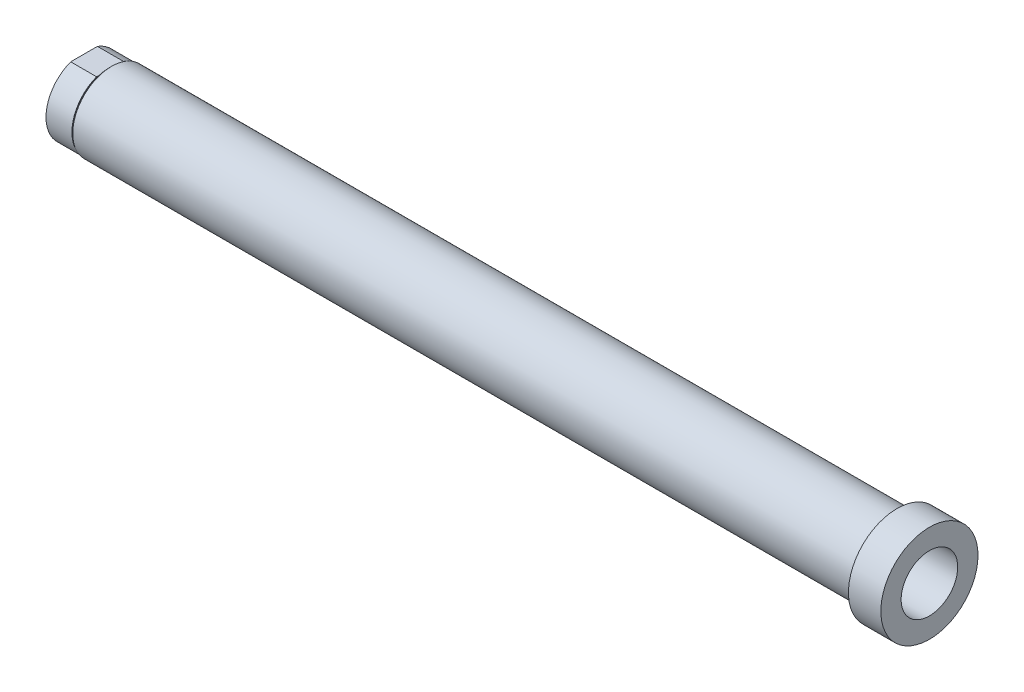
ISO-10303-21;
HEADER;
FILE_DESCRIPTION(('STEP AP214'),'2;1');
FILE_NAME('part.step','',(''),(''),'','','');
FILE_SCHEMA(('AUTOMOTIVE_DESIGN { 1 0 10303 214 1 1 1 1 }'));
ENDSEC;
DATA;
#1=APPLICATION_CONTEXT('core data for automotive mechanical design processes');
#2=APPLICATION_PROTOCOL_DEFINITION('international standard','automotive_design',2000,#1);
#3=PRODUCT_CONTEXT('',#1,'mechanical');
#4=PRODUCT('Part','Part','',(#3));
#5=PRODUCT_RELATED_PRODUCT_CATEGORY('part','',(#4));
#6=PRODUCT_DEFINITION_FORMATION('','',#4);
#7=PRODUCT_DEFINITION_CONTEXT('part definition',#1,'design');
#8=PRODUCT_DEFINITION('design','',#6,#7);
#9=PRODUCT_DEFINITION_SHAPE('','',#8);
#10=(LENGTH_UNIT() NAMED_UNIT(*) SI_UNIT(.MILLI.,.METRE.));
#11=(NAMED_UNIT(*) PLANE_ANGLE_UNIT() SI_UNIT($,.RADIAN.));
#12=(NAMED_UNIT(*) SI_UNIT($,.STERADIAN.) SOLID_ANGLE_UNIT());
#13=UNCERTAINTY_MEASURE_WITH_UNIT(LENGTH_MEASURE(1.E-05),#10,'distance_accuracy_value','');
#14=(GEOMETRIC_REPRESENTATION_CONTEXT(3) GLOBAL_UNCERTAINTY_ASSIGNED_CONTEXT((#13)) GLOBAL_UNIT_ASSIGNED_CONTEXT((#10,
#11,#12)) REPRESENTATION_CONTEXT('',''));
#15=CARTESIAN_POINT('',(0.,0.,0.));
#16=DIRECTION('',(0.,0.,1.));
#17=DIRECTION('',(1.,0.,0.));
#18=AXIS2_PLACEMENT_3D('',#15,#16,#17);
#19=CARTESIAN_POINT('',(63.25,0.,0.));
#20=DIRECTION('',(-1.,0.,0.));
#21=DIRECTION('',(0.,0.,1.));
#22=AXIS2_PLACEMENT_3D('',#19,#20,#21);
#23=CYLINDRICAL_SURFACE('',#22,6.00075);
#24=CARTESIAN_POINT('',(-62.996,0.,0.));
#25=DIRECTION('',(1.,0.,0.));
#26=DIRECTION('',(0.,0.,-1.));
#27=AXIS2_PLACEMENT_3D('',#24,#25,#26);
#28=CIRCLE('',#27,6.00075);
#29=CARTESIAN_POINT('',(-62.996,0.,-6.00075));
#30=VERTEX_POINT('',#29);
#31=EDGE_CURVE('E168',#30,#30,#28,.T.);
#32=ORIENTED_EDGE('',*,*,#31,.T.);
#33=EDGE_LOOP('',(#32));
#34=FACE_BOUND('',#33,.T.);
#35=CARTESIAN_POINT('',(58.25,0.,0.));
#36=DIRECTION('',(1.,0.,0.));
#37=DIRECTION('',(0.,0.,-1.));
#38=AXIS2_PLACEMENT_3D('',#35,#36,#37);
#39=CIRCLE('',#38,6.00075);
#40=CARTESIAN_POINT('',(58.25,0.,-6.00075));
#41=VERTEX_POINT('',#40);
#42=EDGE_CURVE('E12',#41,#41,#39,.T.);
#43=ORIENTED_EDGE('',*,*,#42,.F.);
#44=EDGE_LOOP('',(#43));
#45=FACE_BOUND('',#44,.T.);
#46=ADVANCED_FACE('F44',(#34,#45),#23,.T.);
#47=CARTESIAN_POINT('',(-23.6261718694748,0.,0.));
#48=DIRECTION('',(1.,0.,0.));
#49=DIRECTION('',(0.,0.,-1.));
#50=AXIS2_PLACEMENT_3D('',#47,#48,#49);
#51=CYLINDRICAL_SURFACE('',#50,5.87499999999999);
#52=DIRECTION('',(1.,0.,0.));
#53=VECTOR('',#52,1.);
#54=CARTESIAN_POINT('',(-23.6261718694748,-5.50000000000002,2.06533895523223));
#55=LINE('',#54,#53);
#56=CARTESIAN_POINT('',(-63.25,-5.50000000000001,2.06533895523225));
#57=VERTEX_POINT('',#56);
#58=CARTESIAN_POINT('',(-67.25,-5.50000000000001,2.06533895523223));
#59=VERTEX_POINT('',#58);
#60=EDGE_CURVE('E137',#57,#59,#55,.F.);
#61=ORIENTED_EDGE('',*,*,#60,.F.);
#62=CARTESIAN_POINT('',(-63.25,0.,0.));
#63=DIRECTION('',(1.,0.,0.));
#64=DIRECTION('',(0.,0.,-1.));
#65=AXIS2_PLACEMENT_3D('',#62,#63,#64);
#66=CIRCLE('',#65,5.87499999999999);
#67=CARTESIAN_POINT('',(-63.25,5.5,2.06533895523228));
#68=VERTEX_POINT('',#67);
#69=EDGE_CURVE('E160',#68,#57,#66,.T.);
#70=ORIENTED_EDGE('',*,*,#69,.F.);
#71=DIRECTION('',(1.,0.,0.));
#72=VECTOR('',#71,1.);
#73=CARTESIAN_POINT('',(-23.6261718694748,5.50000000000001,2.06533895523226));
#74=LINE('',#73,#72);
#75=CARTESIAN_POINT('',(-67.25,5.5,2.06533895523226));
#76=VERTEX_POINT('',#75);
#77=EDGE_CURVE('E145',#76,#68,#74,.T.);
#78=ORIENTED_EDGE('',*,*,#77,.F.);
#79=CARTESIAN_POINT('',(-67.25,0.,0.));
#80=DIRECTION('',(1.,0.,0.));
#81=DIRECTION('',(0.,0.,-1.));
#82=AXIS2_PLACEMENT_3D('',#79,#80,#81);
#83=CIRCLE('',#82,5.87499999999999);
#84=EDGE_CURVE('E155',#76,#59,#83,.T.);
#85=ORIENTED_EDGE('',*,*,#84,.T.);
#86=EDGE_LOOP('',(#61,#70,#78,#85));
#87=FACE_BOUND('',#86,.T.);
#88=ADVANCED_FACE('F246',(#87),#51,.T.);
#89=CARTESIAN_POINT('',(-63.25,5.87499999999999,0.));
#90=DIRECTION('',(1.,0.,0.));
#91=DIRECTION('',(0.,0.,-1.));
#92=AXIS2_PLACEMENT_3D('',#89,#90,#91);
#93=PLANE('',#92);
#94=DIRECTION('',(0.,0.,1.));
#95=VECTOR('',#94,1.);
#96=CARTESIAN_POINT('',(-63.25,-5.50000000000001,0.));
#97=LINE('',#96,#95);
#98=CARTESIAN_POINT('',(-63.25,-5.50000000000001,-2.06533895523225));
#99=VERTEX_POINT('',#98);
#100=CARTESIAN_POINT('',(-63.25,-5.50000000000001,-1.66587381349844));
#101=VERTEX_POINT('',#100);
#102=EDGE_CURVE('E53',#99,#101,#97,.T.);
#103=ORIENTED_EDGE('',*,*,#102,.F.);
#104=CARTESIAN_POINT('',(-63.25,5.5,-2.06533895523228));
#105=VERTEX_POINT('',#104);
#106=EDGE_CURVE('E159',#99,#105,#66,.T.);
#107=ORIENTED_EDGE('',*,*,#106,.T.);
#108=DIRECTION('',(0.,0.,-1.));
#109=VECTOR('',#108,1.);
#110=CARTESIAN_POINT('',(-63.25,5.5,0.));
#111=LINE('',#110,#109);
#112=CARTESIAN_POINT('',(-63.25,5.5,-1.66587381349847));
#113=VERTEX_POINT('',#112);
#114=EDGE_CURVE('E196',#113,#105,#111,.T.);
#115=ORIENTED_EDGE('',*,*,#114,.F.);
#116=CARTESIAN_POINT('',(-63.25,0.,0.));
#117=DIRECTION('',(1.,0.,0.));
#118=DIRECTION('',(0.,0.,-1.));
#119=AXIS2_PLACEMENT_3D('',#116,#117,#118);
#120=CIRCLE('',#119,5.74674999999999);
#121=EDGE_CURVE('E224',#113,#101,#120,.F.);
#122=ORIENTED_EDGE('',*,*,#121,.T.);
#123=EDGE_LOOP('',(#103,#107,#115,#122));
#124=FACE_BOUND('',#123,.T.);
#125=ADVANCED_FACE('F237',(#124),#93,.T.);
#126=CARTESIAN_POINT('',(-62.996,0.,0.));
#127=DIRECTION('',(1.,0.,0.));
#128=DIRECTION('',(0.,0.,-1.));
#129=AXIS2_PLACEMENT_3D('',#126,#127,#128);
#130=CONICAL_SURFACE('',#129,6.00075,0.785398163397399);
#131=CARTESIAN_POINT('',(-63.25,5.5,1.66587381349847));
#132=VERTEX_POINT('',#131);
#133=EDGE_CURVE('E197',#132,#113,#120,.F.);
#134=ORIENTED_EDGE('',*,*,#133,.F.);
#135=CARTESIAN_POINT('',(-63.25,-5.50000000000001,1.66587381349844));
#136=VERTEX_POINT('',#135);
#137=EDGE_CURVE('E222',#136,#132,#120,.F.);
#138=ORIENTED_EDGE('',*,*,#137,.F.);
#139=EDGE_CURVE('E227',#101,#136,#120,.F.);
#140=ORIENTED_EDGE('',*,*,#139,.F.);
#141=ORIENTED_EDGE('',*,*,#121,.F.);
#142=EDGE_LOOP('',(#134,#138,#140,#141));
#143=FACE_BOUND('',#142,.T.);
#144=ORIENTED_EDGE('',*,*,#31,.F.);
#145=EDGE_LOOP('',(#144));
#146=FACE_BOUND('',#145,.T.);
#147=ADVANCED_FACE('F46',(#143,#146),#130,.T.);
#148=CARTESIAN_POINT('',(-67.25,5.87499999999999,0.));
#149=DIRECTION('',(-1.,0.,0.));
#150=DIRECTION('',(0.,0.,1.));
#151=AXIS2_PLACEMENT_3D('',#148,#149,#150);
#152=PLANE('',#151);
#153=CARTESIAN_POINT('',(-67.25,0.,0.));
#154=DIRECTION('',(-1.,0.,0.));
#155=DIRECTION('',(0.,0.,1.));
#156=AXIS2_PLACEMENT_3D('',#153,#154,#155);
#157=CIRCLE('',#156,2.5);
#158=CARTESIAN_POINT('',(-67.25,0.,2.5));
#159=VERTEX_POINT('',#158);
#160=EDGE_CURVE('E181',#159,#159,#157,.T.);
#161=ORIENTED_EDGE('',*,*,#160,.F.);
#162=EDGE_LOOP('',(#161));
#163=FACE_BOUND('',#162,.T.);
#164=DIRECTION('',(0.,0.,1.));
#165=VECTOR('',#164,1.);
#166=CARTESIAN_POINT('',(-67.25,-5.50000000000001,-6.00075));
#167=LINE('',#166,#165);
#168=CARTESIAN_POINT('',(-67.25,-5.50000000000001,-2.06533895523223));
#169=VERTEX_POINT('',#168);
#170=EDGE_CURVE('E138',#169,#59,#167,.T.);
#171=ORIENTED_EDGE('',*,*,#170,.T.);
#172=ORIENTED_EDGE('',*,*,#84,.F.);
#173=DIRECTION('',(0.,0.,1.));
#174=VECTOR('',#173,1.);
#175=CARTESIAN_POINT('',(-67.25,5.5,-6.00075));
#176=LINE('',#175,#174);
#177=CARTESIAN_POINT('',(-67.25,5.5,-2.06533895523226));
#178=VERTEX_POINT('',#177);
#179=EDGE_CURVE('E142',#178,#76,#176,.T.);
#180=ORIENTED_EDGE('',*,*,#179,.F.);
#181=EDGE_CURVE('E154',#169,#178,#83,.T.);
#182=ORIENTED_EDGE('',*,*,#181,.F.);
#183=EDGE_LOOP('',(#171,#172,#180,#182));
#184=FACE_BOUND('',#183,.T.);
#185=ADVANCED_FACE('F236',(#163,#184),#152,.T.);
#186=DIRECTION('',(1.,0.,0.));
#187=VECTOR('',#186,1.);
#188=CARTESIAN_POINT('',(-23.6261718694748,-5.50000000000002,-2.06533895523223));
#189=LINE('',#188,#187);
#190=EDGE_CURVE('E132',#169,#99,#189,.T.);
#191=ORIENTED_EDGE('',*,*,#190,.F.);
#192=ORIENTED_EDGE('',*,*,#181,.T.);
#193=DIRECTION('',(1.,0.,0.));
#194=VECTOR('',#193,1.);
#195=CARTESIAN_POINT('',(-23.6261718694748,5.50000000000001,-2.06533895523226));
#196=LINE('',#195,#194);
#197=EDGE_CURVE('E150',#105,#178,#196,.F.);
#198=ORIENTED_EDGE('',*,*,#197,.F.);
#199=ORIENTED_EDGE('',*,*,#106,.F.);
#200=EDGE_LOOP('',(#191,#192,#198,#199));
#201=FACE_BOUND('',#200,.T.);
#202=ADVANCED_FACE('F242',(#201),#51,.T.);
#203=EDGE_CURVE('E200',#136,#57,#97,.T.);
#204=ORIENTED_EDGE('',*,*,#203,.F.);
#205=ORIENTED_EDGE('',*,*,#137,.T.);
#206=EDGE_CURVE('E199',#68,#132,#111,.T.);
#207=ORIENTED_EDGE('',*,*,#206,.F.);
#208=ORIENTED_EDGE('',*,*,#69,.T.);
#209=EDGE_LOOP('',(#204,#205,#207,#208));
#210=FACE_BOUND('',#209,.T.);
#211=ADVANCED_FACE('F249',(#210),#93,.T.);
#212=CARTESIAN_POINT('',(-63.25,5.87499999999999,-6.00075));
#213=DIRECTION('',(1.,0.,0.));
#214=DIRECTION('',(0.,0.,-1.));
#215=AXIS2_PLACEMENT_3D('',#212,#213,#214);
#216=PLANE('',#215);
#217=ORIENTED_EDGE('',*,*,#133,.T.);
#218=DIRECTION('',(0.,0.,1.));
#219=VECTOR('',#218,1.);
#220=CARTESIAN_POINT('',(-63.25,5.5,-6.00075));
#221=LINE('',#220,#219);
#222=EDGE_CURVE('E68',#113,#132,#221,.T.);
#223=ORIENTED_EDGE('',*,*,#222,.T.);
#224=EDGE_LOOP('',(#217,#223));
#225=FACE_BOUND('',#224,.T.);
#226=ADVANCED_FACE('F215',(#225),#216,.F.);
#227=CARTESIAN_POINT('',(-67.25,5.5,-6.00075));
#228=DIRECTION('',(0.,-1.,0.));
#229=DIRECTION('',(1.,0.,0.));
#230=AXIS2_PLACEMENT_3D('',#227,#228,#229);
#231=PLANE('',#230);
#232=ORIENTED_EDGE('',*,*,#197,.T.);
#233=ORIENTED_EDGE('',*,*,#179,.T.);
#234=ORIENTED_EDGE('',*,*,#77,.T.);
#235=ORIENTED_EDGE('',*,*,#206,.T.);
#236=ORIENTED_EDGE('',*,*,#222,.F.);
#237=ORIENTED_EDGE('',*,*,#114,.T.);
#238=EDGE_LOOP('',(#232,#233,#234,#235,#236,#237));
#239=FACE_BOUND('',#238,.T.);
#240=ADVANCED_FACE('F209',(#239),#231,.F.);
#241=CARTESIAN_POINT('',(-67.25,-5.50000000000001,-6.00075));
#242=DIRECTION('',(0.,1.,0.));
#243=DIRECTION('',(-1.,0.,0.));
#244=AXIS2_PLACEMENT_3D('',#241,#242,#243);
#245=PLANE('',#244);
#246=ORIENTED_EDGE('',*,*,#60,.T.);
#247=ORIENTED_EDGE('',*,*,#170,.F.);
#248=ORIENTED_EDGE('',*,*,#190,.T.);
#249=ORIENTED_EDGE('',*,*,#102,.T.);
#250=DIRECTION('',(0.,0.,1.));
#251=VECTOR('',#250,1.);
#252=CARTESIAN_POINT('',(-63.25,-5.50000000000001,-6.00075));
#253=LINE('',#252,#251);
#254=EDGE_CURVE('E60',#101,#136,#253,.T.);
#255=ORIENTED_EDGE('',*,*,#254,.T.);
#256=ORIENTED_EDGE('',*,*,#203,.T.);
#257=EDGE_LOOP('',(#246,#247,#248,#249,#255,#256));
#258=FACE_BOUND('',#257,.T.);
#259=ADVANCED_FACE('F275',(#258),#245,.F.);
#260=CARTESIAN_POINT('',(-63.25,-5.875,-6.00075));
#261=DIRECTION('',(1.,0.,0.));
#262=DIRECTION('',(0.,0.,-1.));
#263=AXIS2_PLACEMENT_3D('',#260,#261,#262);
#264=PLANE('',#263);
#265=ORIENTED_EDGE('',*,*,#139,.T.);
#266=ORIENTED_EDGE('',*,*,#254,.F.);
#267=EDGE_LOOP('',(#265,#266));
#268=FACE_BOUND('',#267,.T.);
#269=ADVANCED_FACE('F277',(#268),#264,.F.);
#270=CARTESIAN_POINT('',(-67.25,0.,0.));
#271=DIRECTION('',(-1.,0.,0.));
#272=DIRECTION('',(0.,0.,1.));
#273=AXIS2_PLACEMENT_3D('',#270,#271,#272);
#274=CYLINDRICAL_SURFACE('',#273,2.5);
#275=CARTESIAN_POINT('',(-60.2396,0.,0.));
#276=DIRECTION('',(-1.,0.,0.));
#277=DIRECTION('',(0.,0.,1.));
#278=AXIS2_PLACEMENT_3D('',#275,#276,#277);
#279=CIRCLE('',#278,2.5);
#280=CARTESIAN_POINT('',(-60.2396,0.,2.5));
#281=VERTEX_POINT('',#280);
#282=EDGE_CURVE('E118',#281,#281,#279,.T.);
#283=ORIENTED_EDGE('',*,*,#282,.F.);
#284=EDGE_LOOP('',(#283));
#285=FACE_BOUND('',#284,.T.);
#286=ORIENTED_EDGE('',*,*,#160,.T.);
#287=EDGE_LOOP('',(#286));
#288=FACE_BOUND('',#287,.T.);
#289=ADVANCED_FACE('F280',(#285,#288),#274,.F.);
#290=CARTESIAN_POINT('',(-60.2396,2.1,0.));
#291=DIRECTION('',(1.,0.,0.));
#292=DIRECTION('',(0.,0.,-1.));
#293=AXIS2_PLACEMENT_3D('',#290,#291,#292);
#294=PLANE('',#293);
#295=CARTESIAN_POINT('',(-60.2396,0.,0.));
#296=DIRECTION('',(-1.,0.,0.));
#297=DIRECTION('',(0.,0.,1.));
#298=AXIS2_PLACEMENT_3D('',#295,#296,#297);
#299=CIRCLE('',#298,2.1);
#300=CARTESIAN_POINT('',(-60.2396,0.,2.1));
#301=VERTEX_POINT('',#300);
#302=EDGE_CURVE('E112',#301,#301,#299,.T.);
#303=ORIENTED_EDGE('',*,*,#302,.F.);
#304=EDGE_LOOP('',(#303));
#305=FACE_BOUND('',#304,.T.);
#306=ORIENTED_EDGE('',*,*,#282,.T.);
#307=EDGE_LOOP('',(#306));
#308=FACE_BOUND('',#307,.T.);
#309=ADVANCED_FACE('F286',(#305,#308),#294,.F.);
#310=CARTESIAN_POINT('',(-67.25,0.,0.));
#311=DIRECTION('',(-1.,0.,0.));
#312=DIRECTION('',(0.,0.,1.));
#313=AXIS2_PLACEMENT_3D('',#310,#311,#312);
#314=CYLINDRICAL_SURFACE('',#313,2.1);
#315=CARTESIAN_POINT('',(-57.8396048,0.,0.));
#316=DIRECTION('',(-1.,0.,0.));
#317=DIRECTION('',(0.,0.,1.));
#318=AXIS2_PLACEMENT_3D('',#315,#316,#317);
#319=CIRCLE('',#318,2.1);
#320=CARTESIAN_POINT('',(-57.8396048,0.,2.1));
#321=VERTEX_POINT('',#320);
#322=EDGE_CURVE('E109',#321,#321,#319,.T.);
#323=ORIENTED_EDGE('',*,*,#322,.F.);
#324=EDGE_LOOP('',(#323));
#325=FACE_BOUND('',#324,.T.);
#326=ORIENTED_EDGE('',*,*,#302,.T.);
#327=EDGE_LOOP('',(#326));
#328=FACE_BOUND('',#327,.T.);
#329=ADVANCED_FACE('F105',(#325,#328),#314,.F.);
#330=CARTESIAN_POINT('',(-57.8396048,0.,0.));
#331=DIRECTION('',(-1.,0.,0.));
#332=DIRECTION('',(0.,0.,1.));
#333=AXIS2_PLACEMENT_3D('',#330,#331,#332);
#334=CONICAL_SURFACE('',#333,2.1,1.02974425867665);
#335=CARTESIAN_POINT('',(-56.5777975000421,0.,0.));
#336=VERTEX_POINT('',#335);
#337=VERTEX_LOOP('',#336);
#338=FACE_BOUND('',#337,.T.);
#339=ORIENTED_EDGE('',*,*,#322,.T.);
#340=EDGE_LOOP('',(#339));
#341=FACE_BOUND('',#340,.T.);
#342=ADVANCED_FACE('F101',(#338,#341),#334,.F.);
#343=CARTESIAN_POINT('',(58.25,0.,0.));
#344=DIRECTION('',(1.,0.,0.));
#345=DIRECTION('',(0.,0.,-1.));
#346=AXIS2_PLACEMENT_3D('',#343,#344,#345);
#347=CYLINDRICAL_SURFACE('',#346,7.5);
#348=CARTESIAN_POINT('',(58.25,0.,0.));
#349=DIRECTION('',(1.,0.,0.));
#350=DIRECTION('',(0.,0.,-1.));
#351=AXIS2_PLACEMENT_3D('',#348,#349,#350);
#352=CIRCLE('',#351,7.5);
#353=CARTESIAN_POINT('',(58.25,0.,-7.5));
#354=VERTEX_POINT('',#353);
#355=EDGE_CURVE('E113',#354,#354,#352,.T.);
#356=ORIENTED_EDGE('',*,*,#355,.T.);
#357=EDGE_LOOP('',(#356));
#358=FACE_BOUND('',#357,.T.);
#359=CARTESIAN_POINT('',(63.25,0.,0.));
#360=DIRECTION('',(1.,0.,0.));
#361=DIRECTION('',(0.,0.,-1.));
#362=AXIS2_PLACEMENT_3D('',#359,#360,#361);
#363=CIRCLE('',#362,7.5);
#364=CARTESIAN_POINT('',(63.25,0.,-7.5));
#365=VERTEX_POINT('',#364);
#366=EDGE_CURVE('E121',#365,#365,#363,.T.);
#367=ORIENTED_EDGE('',*,*,#366,.F.);
#368=EDGE_LOOP('',(#367));
#369=FACE_BOUND('',#368,.T.);
#370=ADVANCED_FACE('F104',(#358,#369),#347,.T.);
#371=CARTESIAN_POINT('',(58.25,0.,0.));
#372=DIRECTION('',(1.,0.,0.));
#373=DIRECTION('',(0.,0.,-1.));
#374=AXIS2_PLACEMENT_3D('',#371,#372,#373);
#375=PLANE('',#374);
#376=ORIENTED_EDGE('',*,*,#42,.T.);
#377=EDGE_LOOP('',(#376));
#378=FACE_BOUND('',#377,.T.);
#379=ORIENTED_EDGE('',*,*,#355,.F.);
#380=EDGE_LOOP('',(#379));
#381=FACE_BOUND('',#380,.T.);
#382=ADVANCED_FACE('F271',(#378,#381),#375,.F.);
#383=CARTESIAN_POINT('',(-56.455,4.365,0.));
#384=DIRECTION('',(1.,0.,0.));
#385=DIRECTION('',(0.,0.,-1.));
#386=AXIS2_PLACEMENT_3D('',#383,#384,#385);
#387=PLANE('',#386);
#388=CARTESIAN_POINT('',(-56.455,0.,0.));
#389=DIRECTION('',(1.,0.,0.));
#390=DIRECTION('',(0.,0.,-1.));
#391=AXIS2_PLACEMENT_3D('',#388,#389,#390);
#392=CIRCLE('',#391,4.365);
#393=CARTESIAN_POINT('',(-56.455,0.,-4.365));
#394=VERTEX_POINT('',#393);
#395=EDGE_CURVE('E191',#394,#394,#392,.T.);
#396=ORIENTED_EDGE('',*,*,#395,.T.);
#397=EDGE_LOOP('',(#396));
#398=FACE_BOUND('',#397,.T.);
#399=ADVANCED_FACE('F263',(#398),#387,.T.);
#400=CARTESIAN_POINT('',(63.25,0.,0.));
#401=DIRECTION('',(-1.,0.,0.));
#402=DIRECTION('',(0.,0.,1.));
#403=AXIS2_PLACEMENT_3D('',#400,#401,#402);
#404=CYLINDRICAL_SURFACE('',#403,4.365);
#405=ORIENTED_EDGE('',*,*,#395,.F.);
#406=EDGE_LOOP('',(#405));
#407=FACE_BOUND('',#406,.T.);
#408=CARTESIAN_POINT('',(63.25,0.,0.));
#409=DIRECTION('',(1.,0.,0.));
#410=DIRECTION('',(0.,0.,-1.));
#411=AXIS2_PLACEMENT_3D('',#408,#409,#410);
#412=CIRCLE('',#411,4.365);
#413=CARTESIAN_POINT('',(63.25,0.,-4.365));
#414=VERTEX_POINT('',#413);
#415=EDGE_CURVE('E164',#414,#414,#412,.T.);
#416=ORIENTED_EDGE('',*,*,#415,.T.);
#417=EDGE_LOOP('',(#416));
#418=FACE_BOUND('',#417,.T.);
#419=ADVANCED_FACE('F260',(#407,#418),#404,.F.);
#420=CARTESIAN_POINT('',(63.25,0.,0.));
#421=DIRECTION('',(1.,0.,0.));
#422=DIRECTION('',(0.,0.,-1.));
#423=AXIS2_PLACEMENT_3D('',#420,#421,#422);
#424=PLANE('',#423);
#425=ORIENTED_EDGE('',*,*,#415,.F.);
#426=EDGE_LOOP('',(#425));
#427=FACE_BOUND('',#426,.T.);
#428=ORIENTED_EDGE('',*,*,#366,.T.);
#429=EDGE_LOOP('',(#428));
#430=FACE_BOUND('',#429,.T.);
#431=ADVANCED_FACE('F257',(#427,#430),#424,.T.);
#432=CLOSED_SHELL('',(#46,#88,#125,#147,#185,#202,#211,#226,#240,#259,#269,#289,#309,#329,#342,
#370,#382,#399,#419,#431));
#433=MANIFOLD_SOLID_BREP('B2',#432);
#434=ADVANCED_BREP_SHAPE_REPRESENTATION('',(#18,#433),#14);
#435=SHAPE_DEFINITION_REPRESENTATION(#9,#434);
ENDSEC;
END-ISO-10303-21;
